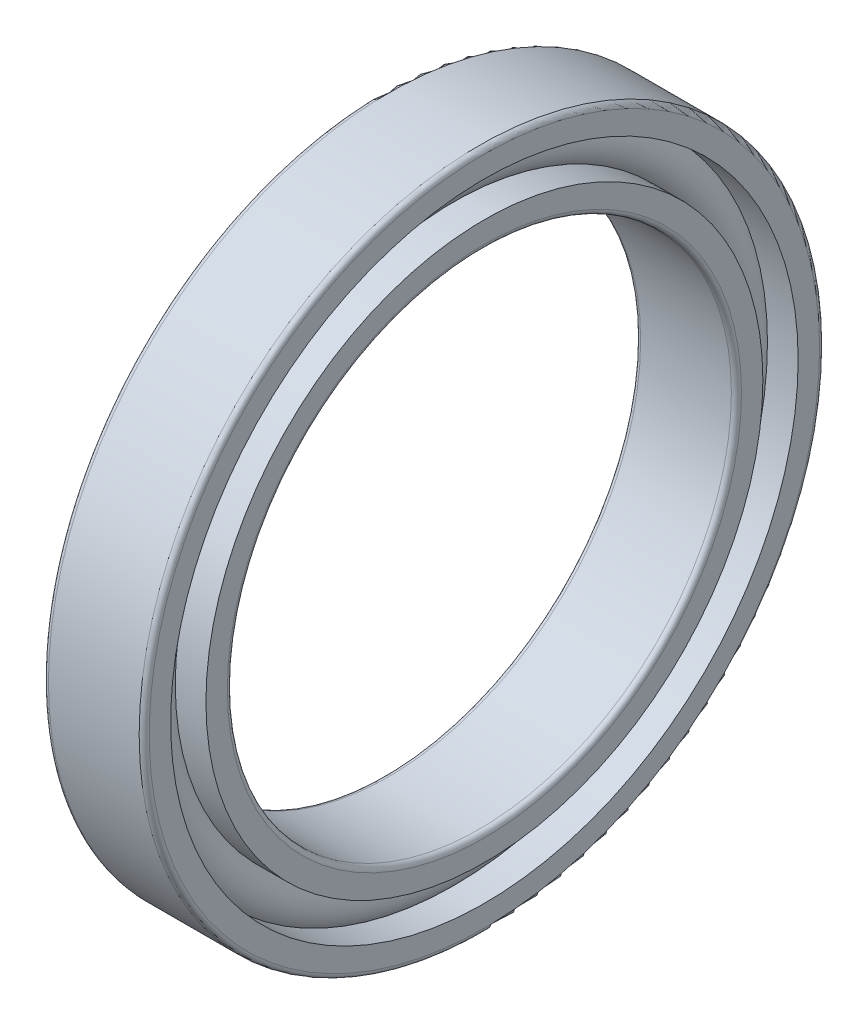
ISO-10303-21;
HEADER;
FILE_DESCRIPTION(('STEP AP214'),'2;1');
FILE_NAME('part.step','',(''),(''),'','','');
FILE_SCHEMA(('AUTOMOTIVE_DESIGN { 1 0 10303 214 1 1 1 1 }'));
ENDSEC;
DATA;
#1=APPLICATION_CONTEXT('core data for automotive mechanical design processes');
#2=APPLICATION_PROTOCOL_DEFINITION('international standard','automotive_design',2000,#1);
#3=PRODUCT_CONTEXT('',#1,'mechanical');
#4=PRODUCT('Part','Part','',(#3));
#5=PRODUCT_RELATED_PRODUCT_CATEGORY('part','',(#4));
#6=PRODUCT_DEFINITION_FORMATION('','',#4);
#7=PRODUCT_DEFINITION_CONTEXT('part definition',#1,'design');
#8=PRODUCT_DEFINITION('design','',#6,#7);
#9=PRODUCT_DEFINITION_SHAPE('','',#8);
#10=(LENGTH_UNIT() NAMED_UNIT(*) SI_UNIT(.MILLI.,.METRE.));
#11=(NAMED_UNIT(*) PLANE_ANGLE_UNIT() SI_UNIT($,.RADIAN.));
#12=(NAMED_UNIT(*) SI_UNIT($,.STERADIAN.) SOLID_ANGLE_UNIT());
#13=UNCERTAINTY_MEASURE_WITH_UNIT(LENGTH_MEASURE(1.E-05),#10,'distance_accuracy_value','');
#14=(GEOMETRIC_REPRESENTATION_CONTEXT(3) GLOBAL_UNCERTAINTY_ASSIGNED_CONTEXT((#13)) GLOBAL_UNIT_ASSIGNED_CONTEXT((#10,
#11,#12)) REPRESENTATION_CONTEXT('',''));
#15=CARTESIAN_POINT('',(0.,0.,0.));
#16=DIRECTION('',(0.,0.,1.));
#17=DIRECTION('',(1.,0.,0.));
#18=AXIS2_PLACEMENT_3D('',#15,#16,#17);
#19=CARTESIAN_POINT('',(0.,0.,0.));
#20=DIRECTION('',(-1.,0.,0.));
#21=DIRECTION('',(0.,0.,1.));
#22=AXIS2_PLACEMENT_3D('',#19,#20,#21);
#23=TOROIDAL_SURFACE('',#22,11.75,1.05);
#24=CARTESIAN_POINT('',(0.782623792124921,0.,0.));
#25=DIRECTION('',(-1.,0.,0.));
#26=DIRECTION('',(0.,0.,1.));
#27=AXIS2_PLACEMENT_3D('',#24,#25,#26);
#28=CIRCLE('',#27,12.45);
#29=CARTESIAN_POINT('',(0.782623792124921,0.,12.45));
#30=VERTEX_POINT('',#29);
#31=EDGE_CURVE('E47',#30,#30,#28,.F.);
#32=ORIENTED_EDGE('',*,*,#31,.T.);
#33=EDGE_LOOP('',(#32));
#34=FACE_BOUND('',#33,.T.);
#35=CARTESIAN_POINT('',(0.782623792124928,0.,0.));
#36=DIRECTION('',(-1.,0.,0.));
#37=DIRECTION('',(0.,0.,1.));
#38=AXIS2_PLACEMENT_3D('',#35,#36,#37);
#39=CIRCLE('',#38,11.05);
#40=CARTESIAN_POINT('',(0.782623792124928,0.,11.05));
#41=VERTEX_POINT('',#40);
#42=EDGE_CURVE('E10',#41,#41,#39,.T.);
#43=ORIENTED_EDGE('',*,*,#42,.T.);
#44=EDGE_LOOP('',(#43));
#45=FACE_BOUND('',#44,.T.);
#46=ADVANCED_FACE('F43',(#34,#45),#23,.T.);
#47=CARTESIAN_POINT('',(-20.6375,0.,0.));
#48=DIRECTION('',(1.,0.,0.));
#49=DIRECTION('',(0.,0.,-1.));
#50=AXIS2_PLACEMENT_3D('',#47,#48,#49);
#51=CYLINDRICAL_SURFACE('',#50,11.05);
#52=CARTESIAN_POINT('',(2.,0.,0.));
#53=DIRECTION('',(1.,0.,0.));
#54=DIRECTION('',(0.,0.,-1.));
#55=AXIS2_PLACEMENT_3D('',#52,#53,#54);
#56=CIRCLE('',#55,11.05);
#57=CARTESIAN_POINT('',(2.,0.,-11.05));
#58=VERTEX_POINT('',#57);
#59=EDGE_CURVE('E58',#58,#58,#56,.T.);
#60=ORIENTED_EDGE('',*,*,#59,.F.);
#61=EDGE_LOOP('',(#60));
#62=FACE_BOUND('',#61,.T.);
#63=ORIENTED_EDGE('',*,*,#42,.F.);
#64=EDGE_LOOP('',(#63));
#65=FACE_BOUND('',#64,.T.);
#66=ADVANCED_FACE('F107',(#62,#65),#51,.T.);
#67=CARTESIAN_POINT('',(-20.6375,0.,0.));
#68=DIRECTION('',(1.,0.,0.));
#69=DIRECTION('',(0.,0.,-1.));
#70=AXIS2_PLACEMENT_3D('',#67,#68,#69);
#71=CYLINDRICAL_SURFACE('',#70,11.05);
#72=CARTESIAN_POINT('',(-2.,0.,0.));
#73=DIRECTION('',(1.,0.,0.));
#74=DIRECTION('',(0.,0.,-1.));
#75=AXIS2_PLACEMENT_3D('',#72,#73,#74);
#76=CIRCLE('',#75,11.05);
#77=CARTESIAN_POINT('',(-2.,0.,-11.05));
#78=VERTEX_POINT('',#77);
#79=EDGE_CURVE('E70',#78,#78,#76,.T.);
#80=ORIENTED_EDGE('',*,*,#79,.T.);
#81=EDGE_LOOP('',(#80));
#82=FACE_BOUND('',#81,.T.);
#83=CARTESIAN_POINT('',(-0.782623792124928,0.,0.));
#84=DIRECTION('',(1.,0.,0.));
#85=DIRECTION('',(0.,0.,-1.));
#86=AXIS2_PLACEMENT_3D('',#83,#84,#85);
#87=CIRCLE('',#86,11.05);
#88=CARTESIAN_POINT('',(-0.782623792124928,0.,-11.05));
#89=VERTEX_POINT('',#88);
#90=EDGE_CURVE('E52',#89,#89,#87,.T.);
#91=ORIENTED_EDGE('',*,*,#90,.F.);
#92=EDGE_LOOP('',(#91));
#93=FACE_BOUND('',#92,.T.);
#94=ADVANCED_FACE('F110',(#82,#93),#71,.T.);
#95=CARTESIAN_POINT('',(2.,10.2,0.));
#96=DIRECTION('',(1.,0.,0.));
#97=DIRECTION('',(0.,0.,-1.));
#98=AXIS2_PLACEMENT_3D('',#95,#96,#97);
#99=PLANE('',#98);
#100=ORIENTED_EDGE('',*,*,#59,.T.);
#101=EDGE_LOOP('',(#100));
#102=FACE_BOUND('',#101,.T.);
#103=CARTESIAN_POINT('',(2.,0.,0.));
#104=DIRECTION('',(1.,0.,0.));
#105=DIRECTION('',(0.,0.,-1.));
#106=AXIS2_PLACEMENT_3D('',#103,#104,#105);
#107=CIRCLE('',#106,10.2);
#108=CARTESIAN_POINT('',(2.,0.,-10.2));
#109=VERTEX_POINT('',#108);
#110=EDGE_CURVE('E97',#109,#109,#107,.T.);
#111=ORIENTED_EDGE('',*,*,#110,.F.);
#112=EDGE_LOOP('',(#111));
#113=FACE_BOUND('',#112,.T.);
#114=ADVANCED_FACE('F104',(#102,#113),#99,.T.);
#115=CARTESIAN_POINT('',(1.8,0.,0.));
#116=DIRECTION('',(1.,0.,0.));
#117=DIRECTION('',(0.,0.,-1.));
#118=AXIS2_PLACEMENT_3D('',#115,#116,#117);
#119=TOROIDAL_SURFACE('',#118,10.2,0.199999999999998);
#120=ORIENTED_EDGE('',*,*,#110,.T.);
#121=EDGE_LOOP('',(#120));
#122=FACE_BOUND('',#121,.T.);
#123=CARTESIAN_POINT('',(1.8,0.,0.));
#124=DIRECTION('',(1.,0.,0.));
#125=DIRECTION('',(0.,0.,-1.));
#126=AXIS2_PLACEMENT_3D('',#123,#124,#125);
#127=CIRCLE('',#126,10.);
#128=CARTESIAN_POINT('',(1.8,0.,-10.));
#129=VERTEX_POINT('',#128);
#130=EDGE_CURVE('E93',#129,#129,#127,.T.);
#131=ORIENTED_EDGE('',*,*,#130,.F.);
#132=EDGE_LOOP('',(#131));
#133=FACE_BOUND('',#132,.T.);
#134=ADVANCED_FACE('F121',(#122,#133),#119,.T.);
#135=CARTESIAN_POINT('',(-20.6375,0.,0.));
#136=DIRECTION('',(1.,0.,0.));
#137=DIRECTION('',(0.,0.,-1.));
#138=AXIS2_PLACEMENT_3D('',#135,#136,#137);
#139=CYLINDRICAL_SURFACE('',#138,10.);
#140=ORIENTED_EDGE('',*,*,#130,.T.);
#141=EDGE_LOOP('',(#140));
#142=FACE_BOUND('',#141,.T.);
#143=CARTESIAN_POINT('',(-1.8,0.,0.));
#144=DIRECTION('',(1.,0.,0.));
#145=DIRECTION('',(0.,0.,-1.));
#146=AXIS2_PLACEMENT_3D('',#143,#144,#145);
#147=CIRCLE('',#146,10.);
#148=CARTESIAN_POINT('',(-1.8,0.,-10.));
#149=VERTEX_POINT('',#148);
#150=EDGE_CURVE('E89',#149,#149,#147,.T.);
#151=ORIENTED_EDGE('',*,*,#150,.F.);
#152=EDGE_LOOP('',(#151));
#153=FACE_BOUND('',#152,.T.);
#154=ADVANCED_FACE('F124',(#142,#153),#139,.F.);
#155=CARTESIAN_POINT('',(-1.8,0.,0.));
#156=DIRECTION('',(1.,0.,0.));
#157=DIRECTION('',(0.,0.,-1.));
#158=AXIS2_PLACEMENT_3D('',#155,#156,#157);
#159=TOROIDAL_SURFACE('',#158,10.2,0.199999999999998);
#160=ORIENTED_EDGE('',*,*,#150,.T.);
#161=EDGE_LOOP('',(#160));
#162=FACE_BOUND('',#161,.T.);
#163=CARTESIAN_POINT('',(-2.,0.,0.));
#164=DIRECTION('',(1.,0.,0.));
#165=DIRECTION('',(0.,0.,-1.));
#166=AXIS2_PLACEMENT_3D('',#163,#164,#165);
#167=CIRCLE('',#166,10.2);
#168=CARTESIAN_POINT('',(-2.,0.,-10.2));
#169=VERTEX_POINT('',#168);
#170=EDGE_CURVE('E85',#169,#169,#167,.T.);
#171=ORIENTED_EDGE('',*,*,#170,.F.);
#172=EDGE_LOOP('',(#171));
#173=FACE_BOUND('',#172,.T.);
#174=ADVANCED_FACE('F128',(#162,#173),#159,.T.);
#175=CARTESIAN_POINT('',(-2.,11.05,0.));
#176=DIRECTION('',(-1.,0.,0.));
#177=DIRECTION('',(0.,0.,1.));
#178=AXIS2_PLACEMENT_3D('',#175,#176,#177);
#179=PLANE('',#178);
#180=ORIENTED_EDGE('',*,*,#170,.T.);
#181=EDGE_LOOP('',(#180));
#182=FACE_BOUND('',#181,.T.);
#183=ORIENTED_EDGE('',*,*,#79,.F.);
#184=EDGE_LOOP('',(#183));
#185=FACE_BOUND('',#184,.T.);
#186=ADVANCED_FACE('F132',(#182,#185),#179,.T.);
#187=CARTESIAN_POINT('',(-0.782623792124921,0.,0.));
#188=DIRECTION('',(1.,0.,0.));
#189=DIRECTION('',(0.,0.,-1.));
#190=AXIS2_PLACEMENT_3D('',#187,#188,#189);
#191=CIRCLE('',#190,12.45);
#192=CARTESIAN_POINT('',(-0.782623792124921,0.,-12.45));
#193=VERTEX_POINT('',#192);
#194=EDGE_CURVE('E61',#193,#193,#191,.F.);
#195=ORIENTED_EDGE('',*,*,#194,.T.);
#196=EDGE_LOOP('',(#195));
#197=FACE_BOUND('',#196,.T.);
#198=ORIENTED_EDGE('',*,*,#90,.T.);
#199=EDGE_LOOP('',(#198));
#200=FACE_BOUND('',#199,.T.);
#201=ADVANCED_FACE('F45',(#197,#200),#23,.T.);
#202=CARTESIAN_POINT('',(-20.6375,0.,0.));
#203=DIRECTION('',(1.,0.,0.));
#204=DIRECTION('',(0.,0.,-1.));
#205=AXIS2_PLACEMENT_3D('',#202,#203,#204);
#206=CYLINDRICAL_SURFACE('',#205,12.45);
#207=CARTESIAN_POINT('',(2.,0.,0.));
#208=DIRECTION('',(1.,0.,0.));
#209=DIRECTION('',(0.,0.,-1.));
#210=AXIS2_PLACEMENT_3D('',#207,#208,#209);
#211=CIRCLE('',#210,12.45);
#212=CARTESIAN_POINT('',(2.,0.,-12.45));
#213=VERTEX_POINT('',#212);
#214=EDGE_CURVE('E64',#213,#213,#211,.T.);
#215=ORIENTED_EDGE('',*,*,#214,.T.);
#216=EDGE_LOOP('',(#215));
#217=FACE_BOUND('',#216,.T.);
#218=ORIENTED_EDGE('',*,*,#31,.F.);
#219=EDGE_LOOP('',(#218));
#220=FACE_BOUND('',#219,.T.);
#221=ADVANCED_FACE('F137',(#217,#220),#206,.F.);
#222=CARTESIAN_POINT('',(-20.6375,0.,0.));
#223=DIRECTION('',(1.,0.,0.));
#224=DIRECTION('',(0.,0.,-1.));
#225=AXIS2_PLACEMENT_3D('',#222,#223,#224);
#226=CYLINDRICAL_SURFACE('',#225,12.45);
#227=CARTESIAN_POINT('',(-2.,0.,0.));
#228=DIRECTION('',(1.,0.,0.));
#229=DIRECTION('',(0.,0.,-1.));
#230=AXIS2_PLACEMENT_3D('',#227,#228,#229);
#231=CIRCLE('',#230,12.45);
#232=CARTESIAN_POINT('',(-2.,0.,-12.45));
#233=VERTEX_POINT('',#232);
#234=EDGE_CURVE('E168',#233,#233,#231,.T.);
#235=ORIENTED_EDGE('',*,*,#234,.F.);
#236=EDGE_LOOP('',(#235));
#237=FACE_BOUND('',#236,.T.);
#238=ORIENTED_EDGE('',*,*,#194,.F.);
#239=EDGE_LOOP('',(#238));
#240=FACE_BOUND('',#239,.T.);
#241=ADVANCED_FACE('F140',(#237,#240),#226,.F.);
#242=CARTESIAN_POINT('',(2.,13.3,0.));
#243=DIRECTION('',(1.,0.,0.));
#244=DIRECTION('',(0.,0.,-1.));
#245=AXIS2_PLACEMENT_3D('',#242,#243,#244);
#246=PLANE('',#245);
#247=CARTESIAN_POINT('',(2.,0.,0.));
#248=DIRECTION('',(1.,0.,0.));
#249=DIRECTION('',(0.,0.,-1.));
#250=AXIS2_PLACEMENT_3D('',#247,#248,#249);
#251=CIRCLE('',#250,13.3);
#252=CARTESIAN_POINT('',(2.,0.,-13.3));
#253=VERTEX_POINT('',#252);
#254=EDGE_CURVE('E72',#253,#253,#251,.T.);
#255=ORIENTED_EDGE('',*,*,#254,.T.);
#256=EDGE_LOOP('',(#255));
#257=FACE_BOUND('',#256,.T.);
#258=ORIENTED_EDGE('',*,*,#214,.F.);
#259=EDGE_LOOP('',(#258));
#260=FACE_BOUND('',#259,.T.);
#261=ADVANCED_FACE('F141',(#257,#260),#246,.T.);
#262=CARTESIAN_POINT('',(1.8,0.,0.));
#263=DIRECTION('',(1.,0.,0.));
#264=DIRECTION('',(0.,0.,-1.));
#265=AXIS2_PLACEMENT_3D('',#262,#263,#264);
#266=TOROIDAL_SURFACE('',#265,13.3,0.199999999999999);
#267=CARTESIAN_POINT('',(1.8,0.,0.));
#268=DIRECTION('',(1.,0.,0.));
#269=DIRECTION('',(0.,0.,-1.));
#270=AXIS2_PLACEMENT_3D('',#267,#268,#269);
#271=CIRCLE('',#270,13.5);
#272=CARTESIAN_POINT('',(1.8,0.,-13.5));
#273=VERTEX_POINT('',#272);
#274=EDGE_CURVE('E78',#273,#273,#271,.T.);
#275=ORIENTED_EDGE('',*,*,#274,.T.);
#276=EDGE_LOOP('',(#275));
#277=FACE_BOUND('',#276,.T.);
#278=ORIENTED_EDGE('',*,*,#254,.F.);
#279=EDGE_LOOP('',(#278));
#280=FACE_BOUND('',#279,.T.);
#281=ADVANCED_FACE('F144',(#277,#280),#266,.T.);
#282=CARTESIAN_POINT('',(-20.6375,0.,0.));
#283=DIRECTION('',(1.,0.,0.));
#284=DIRECTION('',(0.,0.,-1.));
#285=AXIS2_PLACEMENT_3D('',#282,#283,#284);
#286=CYLINDRICAL_SURFACE('',#285,13.5);
#287=CARTESIAN_POINT('',(-1.8,0.,0.));
#288=DIRECTION('',(1.,0.,0.));
#289=DIRECTION('',(0.,0.,-1.));
#290=AXIS2_PLACEMENT_3D('',#287,#288,#289);
#291=CIRCLE('',#290,13.5);
#292=CARTESIAN_POINT('',(-1.8,0.,-13.5));
#293=VERTEX_POINT('',#292);
#294=EDGE_CURVE('E174',#293,#293,#291,.T.);
#295=ORIENTED_EDGE('',*,*,#294,.T.);
#296=EDGE_LOOP('',(#295));
#297=FACE_BOUND('',#296,.T.);
#298=ORIENTED_EDGE('',*,*,#274,.F.);
#299=EDGE_LOOP('',(#298));
#300=FACE_BOUND('',#299,.T.);
#301=ADVANCED_FACE('F148',(#297,#300),#286,.T.);
#302=CARTESIAN_POINT('',(-1.8,0.,0.));
#303=DIRECTION('',(1.,0.,0.));
#304=DIRECTION('',(0.,0.,-1.));
#305=AXIS2_PLACEMENT_3D('',#302,#303,#304);
#306=TOROIDAL_SURFACE('',#305,13.3,0.199999999999999);
#307=CARTESIAN_POINT('',(-2.,0.,0.));
#308=DIRECTION('',(1.,0.,0.));
#309=DIRECTION('',(0.,0.,-1.));
#310=AXIS2_PLACEMENT_3D('',#307,#308,#309);
#311=CIRCLE('',#310,13.3);
#312=CARTESIAN_POINT('',(-2.,0.,-13.3));
#313=VERTEX_POINT('',#312);
#314=EDGE_CURVE('E170',#313,#313,#311,.T.);
#315=ORIENTED_EDGE('',*,*,#314,.T.);
#316=EDGE_LOOP('',(#315));
#317=FACE_BOUND('',#316,.T.);
#318=ORIENTED_EDGE('',*,*,#294,.F.);
#319=EDGE_LOOP('',(#318));
#320=FACE_BOUND('',#319,.T.);
#321=ADVANCED_FACE('F152',(#317,#320),#306,.T.);
#322=CARTESIAN_POINT('',(-2.,12.45,0.));
#323=DIRECTION('',(-1.,0.,0.));
#324=DIRECTION('',(0.,0.,1.));
#325=AXIS2_PLACEMENT_3D('',#322,#323,#324);
#326=PLANE('',#325);
#327=ORIENTED_EDGE('',*,*,#234,.T.);
#328=EDGE_LOOP('',(#327));
#329=FACE_BOUND('',#328,.T.);
#330=ORIENTED_EDGE('',*,*,#314,.F.);
#331=EDGE_LOOP('',(#330));
#332=FACE_BOUND('',#331,.T.);
#333=ADVANCED_FACE('F156',(#329,#332),#326,.T.);
#334=CLOSED_SHELL('',(#46,#66,#94,#114,#134,#154,#174,#186,#201,#221,#241,#261,#281,#301,#321,#333));
#335=MANIFOLD_SOLID_BREP('B2',#334);
#336=ADVANCED_BREP_SHAPE_REPRESENTATION('',(#18,#335),#14);
#337=SHAPE_DEFINITION_REPRESENTATION(#9,#336);
ENDSEC;
END-ISO-10303-21;
